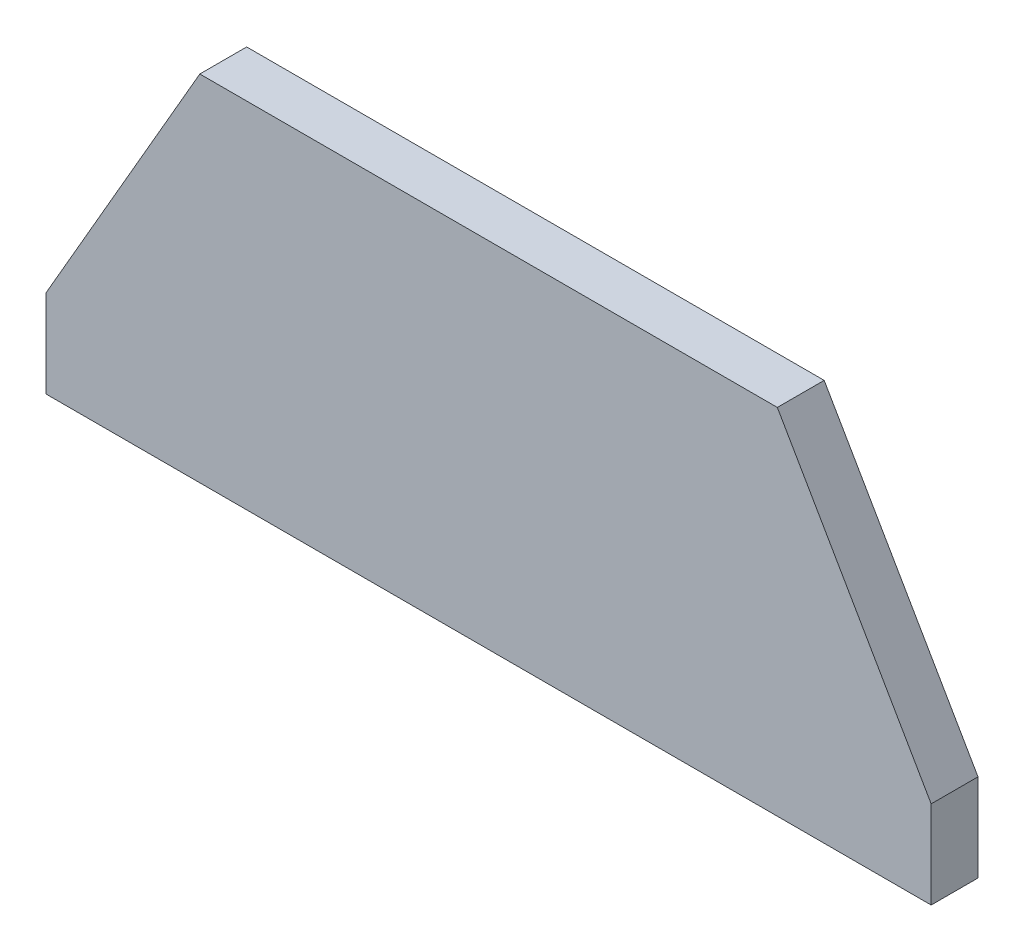
ISO-10303-21;
HEADER;
FILE_DESCRIPTION(('STEP AP214'),'2;1');
FILE_NAME('part.step','',(''),(''),'','','');
FILE_SCHEMA(('AUTOMOTIVE_DESIGN { 1 0 10303 214 1 1 1 1 }'));
ENDSEC;
DATA;
#1=APPLICATION_CONTEXT('core data for automotive mechanical design processes');
#2=APPLICATION_PROTOCOL_DEFINITION('international standard','automotive_design',2000,#1);
#3=PRODUCT_CONTEXT('',#1,'mechanical');
#4=PRODUCT('Part','Part','',(#3));
#5=PRODUCT_RELATED_PRODUCT_CATEGORY('part','',(#4));
#6=PRODUCT_DEFINITION_FORMATION('','',#4);
#7=PRODUCT_DEFINITION_CONTEXT('part definition',#1,'design');
#8=PRODUCT_DEFINITION('design','',#6,#7);
#9=PRODUCT_DEFINITION_SHAPE('','',#8);
#10=(LENGTH_UNIT() NAMED_UNIT(*) SI_UNIT(.MILLI.,.METRE.));
#11=(NAMED_UNIT(*) PLANE_ANGLE_UNIT() SI_UNIT($,.RADIAN.));
#12=(NAMED_UNIT(*) SI_UNIT($,.STERADIAN.) SOLID_ANGLE_UNIT());
#13=UNCERTAINTY_MEASURE_WITH_UNIT(LENGTH_MEASURE(1.E-05),#10,'distance_accuracy_value','');
#14=(GEOMETRIC_REPRESENTATION_CONTEXT(3) GLOBAL_UNCERTAINTY_ASSIGNED_CONTEXT((#13)) GLOBAL_UNIT_ASSIGNED_CONTEXT((#10,
#11,#12)) REPRESENTATION_CONTEXT('',''));
#15=CARTESIAN_POINT('',(0.,0.,0.));
#16=DIRECTION('',(0.,0.,1.));
#17=DIRECTION('',(1.,0.,0.));
#18=AXIS2_PLACEMENT_3D('',#15,#16,#17);
#19=CARTESIAN_POINT('',(15.,-3.03,0.79375));
#20=DIRECTION('',(-1.,0.,0.));
#21=DIRECTION('',(0.,-1.,0.));
#22=AXIS2_PLACEMENT_3D('',#19,#20,#21);
#23=PLANE('',#22);
#24=DIRECTION('',(0.,1.,0.));
#25=VECTOR('',#24,1.);
#26=CARTESIAN_POINT('',(15.,-3.03,-0.79375));
#27=LINE('',#26,#25);
#28=CARTESIAN_POINT('',(15.,-6.00000000000001,-0.79375));
#29=VERTEX_POINT('',#28);
#30=CARTESIAN_POINT('',(15.,-3.03,-0.79375));
#31=VERTEX_POINT('',#30);
#32=EDGE_CURVE('E125',#29,#31,#27,.T.);
#33=ORIENTED_EDGE('',*,*,#32,.T.);
#34=DIRECTION('',(0.,0.,-1.));
#35=VECTOR('',#34,1.);
#36=CARTESIAN_POINT('',(15.,-3.03,0.79375));
#37=LINE('',#36,#35);
#38=CARTESIAN_POINT('',(15.,-3.03,0.79375));
#39=VERTEX_POINT('',#38);
#40=EDGE_CURVE('E11',#39,#31,#37,.T.);
#41=ORIENTED_EDGE('',*,*,#40,.F.);
#42=DIRECTION('',(0.,1.,0.));
#43=VECTOR('',#42,1.);
#44=CARTESIAN_POINT('',(15.,-3.03,0.79375));
#45=LINE('',#44,#43);
#46=CARTESIAN_POINT('',(15.,-6.00000000000001,0.79375));
#47=VERTEX_POINT('',#46);
#48=EDGE_CURVE('E135',#47,#39,#45,.T.);
#49=ORIENTED_EDGE('',*,*,#48,.F.);
#50=DIRECTION('',(0.,0.,-1.));
#51=VECTOR('',#50,1.);
#52=CARTESIAN_POINT('',(15.,-6.00000000000001,0.79375));
#53=LINE('',#52,#51);
#54=EDGE_CURVE('E121',#47,#29,#53,.T.);
#55=ORIENTED_EDGE('',*,*,#54,.T.);
#56=EDGE_LOOP('',(#33,#41,#49,#55));
#57=FACE_BOUND('',#56,.T.);
#58=ADVANCED_FACE('F41',(#57),#23,.F.);
#59=CARTESIAN_POINT('',(9.78652706921766,6.,0.79375));
#60=DIRECTION('',(-0.866025403784438,-0.500000000000001,0.));
#61=DIRECTION('',(0.500000000000001,-0.866025403784438,0.));
#62=AXIS2_PLACEMENT_3D('',#59,#60,#61);
#63=PLANE('',#62);
#64=DIRECTION('',(-0.500000000000001,0.866025403784438,0.));
#65=VECTOR('',#64,1.);
#66=CARTESIAN_POINT('',(9.78652706921766,6.,-0.79375));
#67=LINE('',#66,#65);
#68=CARTESIAN_POINT('',(9.78652706921766,6.,-0.79375));
#69=VERTEX_POINT('',#68);
#70=EDGE_CURVE('E128',#31,#69,#67,.T.);
#71=ORIENTED_EDGE('',*,*,#70,.T.);
#72=DIRECTION('',(0.,0.,-1.));
#73=VECTOR('',#72,1.);
#74=CARTESIAN_POINT('',(9.78652706921766,6.,0.79375));
#75=LINE('',#74,#73);
#76=CARTESIAN_POINT('',(9.78652706921766,6.,0.79375));
#77=VERTEX_POINT('',#76);
#78=EDGE_CURVE('E49',#77,#69,#75,.T.);
#79=ORIENTED_EDGE('',*,*,#78,.F.);
#80=DIRECTION('',(-0.500000000000001,0.866025403784438,0.));
#81=VECTOR('',#80,1.);
#82=CARTESIAN_POINT('',(9.78652706921766,6.,0.79375));
#83=LINE('',#82,#81);
#84=EDGE_CURVE('E94',#39,#77,#83,.T.);
#85=ORIENTED_EDGE('',*,*,#84,.F.);
#86=ORIENTED_EDGE('',*,*,#40,.T.);
#87=EDGE_LOOP('',(#71,#79,#85,#86));
#88=FACE_BOUND('',#87,.T.);
#89=ADVANCED_FACE('F159',(#88),#63,.F.);
#90=CARTESIAN_POINT('',(-9.78652706921767,6.,0.79375));
#91=DIRECTION('',(0.,-1.,0.));
#92=DIRECTION('',(0.,0.,-1.));
#93=AXIS2_PLACEMENT_3D('',#90,#91,#92);
#94=PLANE('',#93);
#95=DIRECTION('',(-1.,0.,0.));
#96=VECTOR('',#95,1.);
#97=CARTESIAN_POINT('',(-9.78652706921767,6.,-0.79375));
#98=LINE('',#97,#96);
#99=CARTESIAN_POINT('',(-9.78652706921767,6.,-0.79375));
#100=VERTEX_POINT('',#99);
#101=EDGE_CURVE('E130',#69,#100,#98,.T.);
#102=ORIENTED_EDGE('',*,*,#101,.T.);
#103=DIRECTION('',(0.,0.,-1.));
#104=VECTOR('',#103,1.);
#105=CARTESIAN_POINT('',(-9.78652706921767,6.,0.79375));
#106=LINE('',#105,#104);
#107=CARTESIAN_POINT('',(-9.78652706921767,6.,0.79375));
#108=VERTEX_POINT('',#107);
#109=EDGE_CURVE('E116',#108,#100,#106,.T.);
#110=ORIENTED_EDGE('',*,*,#109,.F.);
#111=DIRECTION('',(-1.,0.,0.));
#112=VECTOR('',#111,1.);
#113=CARTESIAN_POINT('',(-9.78652706921767,6.,0.79375));
#114=LINE('',#113,#112);
#115=EDGE_CURVE('E107',#77,#108,#114,.T.);
#116=ORIENTED_EDGE('',*,*,#115,.F.);
#117=ORIENTED_EDGE('',*,*,#78,.T.);
#118=EDGE_LOOP('',(#102,#110,#116,#117));
#119=FACE_BOUND('',#118,.T.);
#120=ADVANCED_FACE('F141',(#119),#94,.F.);
#121=CARTESIAN_POINT('',(-9.78652706921767,6.,0.79375));
#122=DIRECTION('',(0.866025403784438,-0.500000000000001,0.));
#123=DIRECTION('',(0.500000000000001,0.866025403784438,0.));
#124=AXIS2_PLACEMENT_3D('',#121,#122,#123);
#125=PLANE('',#124);
#126=DIRECTION('',(-0.500000000000001,-0.866025403784438,0.));
#127=VECTOR('',#126,1.);
#128=CARTESIAN_POINT('',(-9.78652706921767,6.,-0.79375));
#129=LINE('',#128,#127);
#130=CARTESIAN_POINT('',(-15.,-3.03,-0.79375));
#131=VERTEX_POINT('',#130);
#132=EDGE_CURVE('E115',#100,#131,#129,.T.);
#133=ORIENTED_EDGE('',*,*,#132,.T.);
#134=DIRECTION('',(0.,0.,-1.));
#135=VECTOR('',#134,1.);
#136=CARTESIAN_POINT('',(-15.,-3.03,0.79375));
#137=LINE('',#136,#135);
#138=CARTESIAN_POINT('',(-15.,-3.03,0.79375));
#139=VERTEX_POINT('',#138);
#140=EDGE_CURVE('E112',#139,#131,#137,.T.);
#141=ORIENTED_EDGE('',*,*,#140,.F.);
#142=DIRECTION('',(-0.500000000000001,-0.866025403784438,0.));
#143=VECTOR('',#142,1.);
#144=CARTESIAN_POINT('',(-9.78652706921767,6.,0.79375));
#145=LINE('',#144,#143);
#146=EDGE_CURVE('E101',#108,#139,#145,.T.);
#147=ORIENTED_EDGE('',*,*,#146,.F.);
#148=ORIENTED_EDGE('',*,*,#109,.T.);
#149=EDGE_LOOP('',(#133,#141,#147,#148));
#150=FACE_BOUND('',#149,.T.);
#151=ADVANCED_FACE('F113',(#150),#125,.F.);
#152=CARTESIAN_POINT('',(-15.,-6.,0.79375));
#153=DIRECTION('',(1.,0.,0.));
#154=DIRECTION('',(0.,0.,-1.));
#155=AXIS2_PLACEMENT_3D('',#152,#153,#154);
#156=PLANE('',#155);
#157=DIRECTION('',(0.,-1.,0.));
#158=VECTOR('',#157,1.);
#159=CARTESIAN_POINT('',(-15.,-6.,-0.79375));
#160=LINE('',#159,#158);
#161=CARTESIAN_POINT('',(-15.,-6.,-0.79375));
#162=VERTEX_POINT('',#161);
#163=EDGE_CURVE('E80',#131,#162,#160,.T.);
#164=ORIENTED_EDGE('',*,*,#163,.T.);
#165=DIRECTION('',(0.,0.,-1.));
#166=VECTOR('',#165,1.);
#167=CARTESIAN_POINT('',(-15.,-6.,0.79375));
#168=LINE('',#167,#166);
#169=CARTESIAN_POINT('',(-15.,-6.,0.79375));
#170=VERTEX_POINT('',#169);
#171=EDGE_CURVE('E117',#170,#162,#168,.T.);
#172=ORIENTED_EDGE('',*,*,#171,.F.);
#173=DIRECTION('',(0.,-1.,0.));
#174=VECTOR('',#173,1.);
#175=CARTESIAN_POINT('',(-15.,-6.,0.79375));
#176=LINE('',#175,#174);
#177=EDGE_CURVE('E105',#139,#170,#176,.T.);
#178=ORIENTED_EDGE('',*,*,#177,.F.);
#179=ORIENTED_EDGE('',*,*,#140,.T.);
#180=EDGE_LOOP('',(#164,#172,#178,#179));
#181=FACE_BOUND('',#180,.T.);
#182=ADVANCED_FACE('F119',(#181),#156,.F.);
#183=CARTESIAN_POINT('',(-15.,-6.,0.79375));
#184=DIRECTION('',(0.,1.,0.));
#185=DIRECTION('',(-1.,0.,0.));
#186=AXIS2_PLACEMENT_3D('',#183,#184,#185);
#187=PLANE('',#186);
#188=DIRECTION('',(1.,0.,0.));
#189=VECTOR('',#188,1.);
#190=CARTESIAN_POINT('',(-15.,-6.,-0.79375));
#191=LINE('',#190,#189);
#192=EDGE_CURVE('E86',#162,#29,#191,.T.);
#193=ORIENTED_EDGE('',*,*,#192,.T.);
#194=ORIENTED_EDGE('',*,*,#54,.F.);
#195=DIRECTION('',(1.,0.,0.));
#196=VECTOR('',#195,1.);
#197=CARTESIAN_POINT('',(-15.,-6.,0.79375));
#198=LINE('',#197,#196);
#199=EDGE_CURVE('E57',#170,#47,#198,.T.);
#200=ORIENTED_EDGE('',*,*,#199,.F.);
#201=ORIENTED_EDGE('',*,*,#171,.T.);
#202=EDGE_LOOP('',(#193,#194,#200,#201));
#203=FACE_BOUND('',#202,.T.);
#204=ADVANCED_FACE('F148',(#203),#187,.F.);
#205=CARTESIAN_POINT('',(0.,0.,0.79375));
#206=DIRECTION('',(0.,0.,1.));
#207=DIRECTION('',(1.,0.,0.));
#208=AXIS2_PLACEMENT_3D('',#205,#206,#207);
#209=PLANE('',#208);
#210=ORIENTED_EDGE('',*,*,#48,.T.);
#211=ORIENTED_EDGE('',*,*,#84,.T.);
#212=ORIENTED_EDGE('',*,*,#115,.T.);
#213=ORIENTED_EDGE('',*,*,#146,.T.);
#214=ORIENTED_EDGE('',*,*,#177,.T.);
#215=ORIENTED_EDGE('',*,*,#199,.T.);
#216=EDGE_LOOP('',(#210,#211,#212,#213,#214,#215));
#217=FACE_BOUND('',#216,.T.);
#218=ADVANCED_FACE('F103',(#217),#209,.T.);
#219=CARTESIAN_POINT('',(0.,0.,-0.79375));
#220=DIRECTION('',(0.,0.,1.));
#221=DIRECTION('',(1.,0.,0.));
#222=AXIS2_PLACEMENT_3D('',#219,#220,#221);
#223=PLANE('',#222);
#224=ORIENTED_EDGE('',*,*,#32,.F.);
#225=ORIENTED_EDGE('',*,*,#192,.F.);
#226=ORIENTED_EDGE('',*,*,#163,.F.);
#227=ORIENTED_EDGE('',*,*,#132,.F.);
#228=ORIENTED_EDGE('',*,*,#101,.F.);
#229=ORIENTED_EDGE('',*,*,#70,.F.);
#230=EDGE_LOOP('',(#224,#225,#226,#227,#228,#229));
#231=FACE_BOUND('',#230,.T.);
#232=ADVANCED_FACE('F144',(#231),#223,.F.);
#233=CLOSED_SHELL('',(#58,#89,#120,#151,#182,#204,#218,#232));
#234=MANIFOLD_SOLID_BREP('B2',#233);
#235=ADVANCED_BREP_SHAPE_REPRESENTATION('',(#18,#234),#14);
#236=SHAPE_DEFINITION_REPRESENTATION(#9,#235);
ENDSEC;
END-ISO-10303-21;
